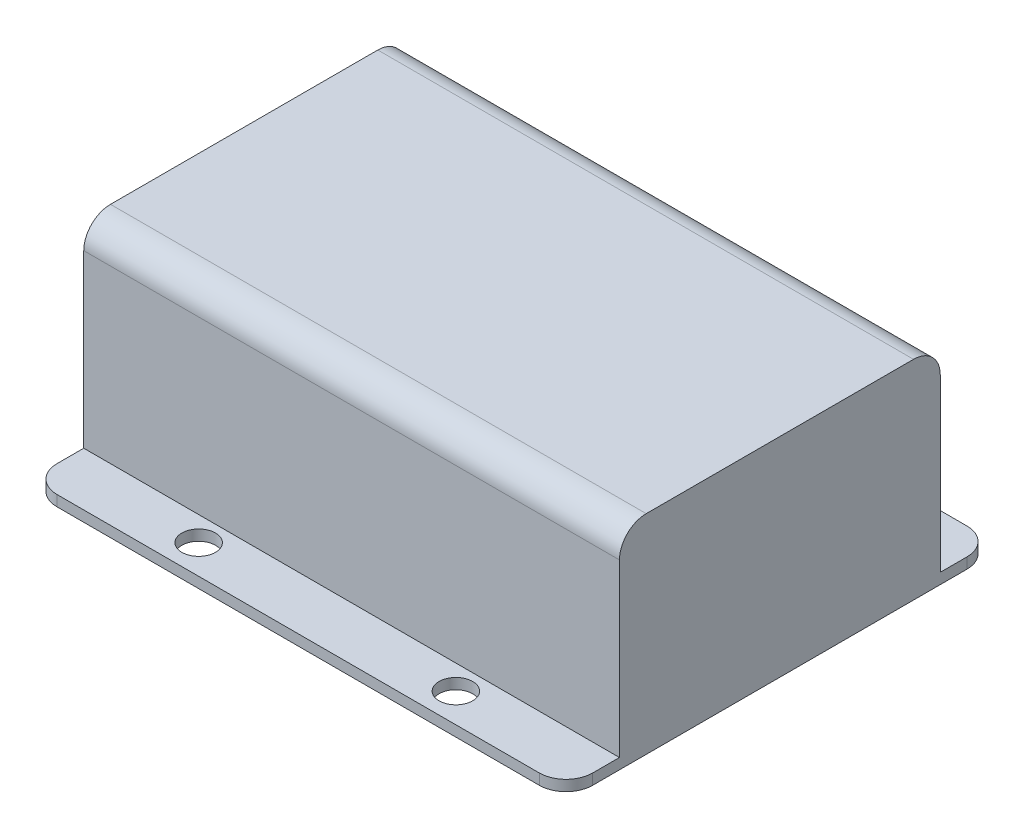
ISO-10303-21;
HEADER;
FILE_DESCRIPTION(('STEP AP214'),'2;1');
FILE_NAME('part.step','',(''),(''),'','','');
FILE_SCHEMA(('AUTOMOTIVE_DESIGN { 1 0 10303 214 1 1 1 1 }'));
ENDSEC;
DATA;
#1=APPLICATION_CONTEXT('core data for automotive mechanical design processes');
#2=APPLICATION_PROTOCOL_DEFINITION('international standard','automotive_design',2000,#1);
#3=PRODUCT_CONTEXT('',#1,'mechanical');
#4=PRODUCT('Part','Part','',(#3));
#5=PRODUCT_RELATED_PRODUCT_CATEGORY('part','',(#4));
#6=PRODUCT_DEFINITION_FORMATION('','',#4);
#7=PRODUCT_DEFINITION_CONTEXT('part definition',#1,'design');
#8=PRODUCT_DEFINITION('design','',#6,#7);
#9=PRODUCT_DEFINITION_SHAPE('','',#8);
#10=(LENGTH_UNIT() NAMED_UNIT(*) SI_UNIT(.MILLI.,.METRE.));
#11=(NAMED_UNIT(*) PLANE_ANGLE_UNIT() SI_UNIT($,.RADIAN.));
#12=(NAMED_UNIT(*) SI_UNIT($,.STERADIAN.) SOLID_ANGLE_UNIT());
#13=UNCERTAINTY_MEASURE_WITH_UNIT(LENGTH_MEASURE(1.E-05),#10,'distance_accuracy_value','');
#14=(GEOMETRIC_REPRESENTATION_CONTEXT(3) GLOBAL_UNCERTAINTY_ASSIGNED_CONTEXT((#13)) GLOBAL_UNIT_ASSIGNED_CONTEXT((#10,
#11,#12)) REPRESENTATION_CONTEXT('',''));
#15=CARTESIAN_POINT('',(0.,0.,0.));
#16=DIRECTION('',(0.,0.,1.));
#17=DIRECTION('',(1.,0.,0.));
#18=AXIS2_PLACEMENT_3D('',#15,#16,#17);
#19=CARTESIAN_POINT('',(0.,2.,0.));
#20=DIRECTION('',(0.,1.,0.));
#21=DIRECTION('',(0.,0.,1.));
#22=AXIS2_PLACEMENT_3D('',#19,#20,#21);
#23=PLANE('',#22);
#24=DIRECTION('',(-1.,0.,0.));
#25=VECTOR('',#24,1.);
#26=CARTESIAN_POINT('',(-50.01,2.,-40.));
#27=LINE('',#26,#25);
#28=CARTESIAN_POINT('',(45.19,2.,-40.));
#29=VERTEX_POINT('',#28);
#30=CARTESIAN_POINT('',(-45.01,2.,-40.));
#31=VERTEX_POINT('',#30);
#32=EDGE_CURVE('E164',#29,#31,#27,.T.);
#33=ORIENTED_EDGE('',*,*,#32,.T.);
#34=CARTESIAN_POINT('',(-45.01,2.,-35.));
#35=DIRECTION('',(0.,1.,0.));
#36=DIRECTION('',(0.,0.,1.));
#37=AXIS2_PLACEMENT_3D('',#34,#35,#36);
#38=CIRCLE('',#37,5.);
#39=CARTESIAN_POINT('',(-50.01,2.,-35.));
#40=VERTEX_POINT('',#39);
#41=EDGE_CURVE('E274',#31,#40,#38,.T.);
#42=ORIENTED_EDGE('',*,*,#41,.T.);
#43=DIRECTION('',(0.,0.,1.));
#44=VECTOR('',#43,1.);
#45=CARTESIAN_POINT('',(-50.01,2.,-40.));
#46=LINE('',#45,#44);
#47=CARTESIAN_POINT('',(-50.01,2.,-30.));
#48=VERTEX_POINT('',#47);
#49=EDGE_CURVE('E219',#40,#48,#46,.T.);
#50=ORIENTED_EDGE('',*,*,#49,.T.);
#51=DIRECTION('',(-1.,0.,0.));
#52=VECTOR('',#51,1.);
#53=CARTESIAN_POINT('',(-50.01,2.,-30.));
#54=LINE('',#53,#52);
#55=CARTESIAN_POINT('',(50.19,2.,-30.));
#56=VERTEX_POINT('',#55);
#57=EDGE_CURVE('E169',#56,#48,#54,.T.);
#58=ORIENTED_EDGE('',*,*,#57,.F.);
#59=DIRECTION('',(0.,0.,-1.));
#60=VECTOR('',#59,1.);
#61=CARTESIAN_POINT('',(50.19,2.,-40.));
#62=LINE('',#61,#60);
#63=CARTESIAN_POINT('',(50.19,2.,-35.));
#64=VERTEX_POINT('',#63);
#65=EDGE_CURVE('E165',#56,#64,#62,.T.);
#66=ORIENTED_EDGE('',*,*,#65,.T.);
#67=CARTESIAN_POINT('',(45.19,2.,-35.));
#68=DIRECTION('',(0.,1.,0.));
#69=DIRECTION('',(0.,0.,1.));
#70=AXIS2_PLACEMENT_3D('',#67,#68,#69);
#71=CIRCLE('',#70,5.);
#72=EDGE_CURVE('E271',#64,#29,#71,.T.);
#73=ORIENTED_EDGE('',*,*,#72,.T.);
#74=EDGE_LOOP('',(#33,#42,#50,#58,#66,#73));
#75=FACE_BOUND('',#74,.T.);
#76=CARTESIAN_POINT('',(24.14,2.,-34.55));
#77=DIRECTION('',(0.,1.,0.));
#78=DIRECTION('',(0.,0.,1.));
#79=AXIS2_PLACEMENT_3D('',#76,#77,#78);
#80=CIRCLE('',#79,3.13999999999999);
#81=CARTESIAN_POINT('',(24.14,2.,-31.41));
#82=VERTEX_POINT('',#81);
#83=EDGE_CURVE('E203',#82,#82,#80,.T.);
#84=ORIENTED_EDGE('',*,*,#83,.F.);
#85=EDGE_LOOP('',(#84));
#86=FACE_BOUND('',#85,.T.);
#87=CARTESIAN_POINT('',(-23.96,2.,-34.55));
#88=DIRECTION('',(0.,1.,0.));
#89=DIRECTION('',(0.,0.,1.));
#90=AXIS2_PLACEMENT_3D('',#87,#88,#89);
#91=CIRCLE('',#90,3.13999999999999);
#92=CARTESIAN_POINT('',(-23.96,2.,-31.41));
#93=VERTEX_POINT('',#92);
#94=EDGE_CURVE('E211',#93,#93,#91,.T.);
#95=ORIENTED_EDGE('',*,*,#94,.F.);
#96=EDGE_LOOP('',(#95));
#97=FACE_BOUND('',#96,.T.);
#98=ADVANCED_FACE('F39',(#75,#86,#97),#23,.T.);
#99=DIRECTION('',(1.,0.,0.));
#100=VECTOR('',#99,1.);
#101=CARTESIAN_POINT('',(-50.01,2.,40.));
#102=LINE('',#101,#100);
#103=CARTESIAN_POINT('',(-45.01,2.,40.));
#104=VERTEX_POINT('',#103);
#105=CARTESIAN_POINT('',(45.19,2.,40.));
#106=VERTEX_POINT('',#105);
#107=EDGE_CURVE('E223',#104,#106,#102,.T.);
#108=ORIENTED_EDGE('',*,*,#107,.T.);
#109=CARTESIAN_POINT('',(45.19,2.,35.));
#110=DIRECTION('',(0.,1.,0.));
#111=DIRECTION('',(0.,0.,1.));
#112=AXIS2_PLACEMENT_3D('',#109,#110,#111);
#113=CIRCLE('',#112,5.);
#114=CARTESIAN_POINT('',(50.19,2.,35.));
#115=VERTEX_POINT('',#114);
#116=EDGE_CURVE('E162',#106,#115,#113,.T.);
#117=ORIENTED_EDGE('',*,*,#116,.T.);
#118=CARTESIAN_POINT('',(50.19,2.,30.));
#119=VERTEX_POINT('',#118);
#120=EDGE_CURVE('E145',#115,#119,#62,.T.);
#121=ORIENTED_EDGE('',*,*,#120,.T.);
#122=DIRECTION('',(1.,0.,0.));
#123=VECTOR('',#122,1.);
#124=CARTESIAN_POINT('',(-50.01,2.,30.));
#125=LINE('',#124,#123);
#126=CARTESIAN_POINT('',(-50.01,2.,30.));
#127=VERTEX_POINT('',#126);
#128=EDGE_CURVE('E159',#127,#119,#125,.T.);
#129=ORIENTED_EDGE('',*,*,#128,.F.);
#130=CARTESIAN_POINT('',(-50.01,2.,35.));
#131=VERTEX_POINT('',#130);
#132=EDGE_CURVE('E224',#127,#131,#46,.T.);
#133=ORIENTED_EDGE('',*,*,#132,.T.);
#134=CARTESIAN_POINT('',(-45.01,2.,35.));
#135=DIRECTION('',(0.,1.,0.));
#136=DIRECTION('',(0.,0.,1.));
#137=AXIS2_PLACEMENT_3D('',#134,#135,#136);
#138=CIRCLE('',#137,5.);
#139=EDGE_CURVE('E290',#131,#104,#138,.T.);
#140=ORIENTED_EDGE('',*,*,#139,.T.);
#141=EDGE_LOOP('',(#108,#117,#121,#129,#133,#140));
#142=FACE_BOUND('',#141,.T.);
#143=CARTESIAN_POINT('',(24.1400000000007,2.,34.55));
#144=DIRECTION('',(0.,1.,0.));
#145=DIRECTION('',(0.,0.,1.));
#146=AXIS2_PLACEMENT_3D('',#143,#144,#145);
#147=CIRCLE('',#146,3.13999999999999);
#148=CARTESIAN_POINT('',(24.1400000000007,2.,37.69));
#149=VERTEX_POINT('',#148);
#150=EDGE_CURVE('E195',#149,#149,#147,.T.);
#151=ORIENTED_EDGE('',*,*,#150,.F.);
#152=EDGE_LOOP('',(#151));
#153=FACE_BOUND('',#152,.T.);
#154=CARTESIAN_POINT('',(-23.9599999999993,2.,34.55));
#155=DIRECTION('',(0.,1.,0.));
#156=DIRECTION('',(0.,0.,1.));
#157=AXIS2_PLACEMENT_3D('',#154,#155,#156);
#158=CIRCLE('',#157,3.13999999999999);
#159=CARTESIAN_POINT('',(-23.9599999999993,2.,37.69));
#160=VERTEX_POINT('',#159);
#161=EDGE_CURVE('E187',#160,#160,#158,.T.);
#162=ORIENTED_EDGE('',*,*,#161,.F.);
#163=EDGE_LOOP('',(#162));
#164=FACE_BOUND('',#163,.T.);
#165=ADVANCED_FACE('F156',(#142,#153,#164),#23,.T.);
#166=CARTESIAN_POINT('',(0.,0.,0.));
#167=DIRECTION('',(0.,1.,0.));
#168=DIRECTION('',(0.,0.,1.));
#169=AXIS2_PLACEMENT_3D('',#166,#167,#168);
#170=PLANE('',#169);
#171=DIRECTION('',(0.,0.,1.));
#172=VECTOR('',#171,1.);
#173=CARTESIAN_POINT('',(-50.01,0.,-40.));
#174=LINE('',#173,#172);
#175=CARTESIAN_POINT('',(-50.01,0.,-35.));
#176=VERTEX_POINT('',#175);
#177=CARTESIAN_POINT('',(-50.01,0.,35.));
#178=VERTEX_POINT('',#177);
#179=EDGE_CURVE('E215',#176,#178,#174,.T.);
#180=ORIENTED_EDGE('',*,*,#179,.F.);
#181=CARTESIAN_POINT('',(-45.01,0.,-35.));
#182=DIRECTION('',(0.,1.,0.));
#183=DIRECTION('',(0.,0.,1.));
#184=AXIS2_PLACEMENT_3D('',#181,#182,#183);
#185=CIRCLE('',#184,5.);
#186=CARTESIAN_POINT('',(-45.01,0.,-40.));
#187=VERTEX_POINT('',#186);
#188=EDGE_CURVE('E261',#176,#187,#185,.F.);
#189=ORIENTED_EDGE('',*,*,#188,.T.);
#190=DIRECTION('',(-1.,0.,0.));
#191=VECTOR('',#190,1.);
#192=CARTESIAN_POINT('',(-50.01,0.,-40.));
#193=LINE('',#192,#191);
#194=CARTESIAN_POINT('',(45.19,0.,-40.));
#195=VERTEX_POINT('',#194);
#196=EDGE_CURVE('E242',#195,#187,#193,.T.);
#197=ORIENTED_EDGE('',*,*,#196,.F.);
#198=CARTESIAN_POINT('',(45.19,0.,-35.));
#199=DIRECTION('',(0.,1.,0.));
#200=DIRECTION('',(0.,0.,1.));
#201=AXIS2_PLACEMENT_3D('',#198,#199,#200);
#202=CIRCLE('',#201,5.);
#203=CARTESIAN_POINT('',(50.19,0.,-35.));
#204=VERTEX_POINT('',#203);
#205=EDGE_CURVE('E258',#195,#204,#202,.F.);
#206=ORIENTED_EDGE('',*,*,#205,.T.);
#207=DIRECTION('',(0.,0.,-1.));
#208=VECTOR('',#207,1.);
#209=CARTESIAN_POINT('',(50.19,0.,-40.));
#210=LINE('',#209,#208);
#211=CARTESIAN_POINT('',(50.19,0.,35.));
#212=VERTEX_POINT('',#211);
#213=EDGE_CURVE('E238',#212,#204,#210,.T.);
#214=ORIENTED_EDGE('',*,*,#213,.F.);
#215=CARTESIAN_POINT('',(45.19,0.,35.));
#216=DIRECTION('',(0.,1.,0.));
#217=DIRECTION('',(0.,0.,1.));
#218=AXIS2_PLACEMENT_3D('',#215,#216,#217);
#219=CIRCLE('',#218,5.);
#220=CARTESIAN_POINT('',(45.19,0.,40.));
#221=VERTEX_POINT('',#220);
#222=EDGE_CURVE('E255',#212,#221,#219,.F.);
#223=ORIENTED_EDGE('',*,*,#222,.T.);
#224=DIRECTION('',(1.,0.,0.));
#225=VECTOR('',#224,1.);
#226=CARTESIAN_POINT('',(-50.01,0.,40.));
#227=LINE('',#226,#225);
#228=CARTESIAN_POINT('',(-45.01,0.,40.));
#229=VERTEX_POINT('',#228);
#230=EDGE_CURVE('E234',#229,#221,#227,.T.);
#231=ORIENTED_EDGE('',*,*,#230,.F.);
#232=CARTESIAN_POINT('',(-45.01,0.,35.));
#233=DIRECTION('',(0.,1.,0.));
#234=DIRECTION('',(0.,0.,1.));
#235=AXIS2_PLACEMENT_3D('',#232,#233,#234);
#236=CIRCLE('',#235,5.);
#237=EDGE_CURVE('E252',#229,#178,#236,.F.);
#238=ORIENTED_EDGE('',*,*,#237,.T.);
#239=EDGE_LOOP('',(#180,#189,#197,#206,#214,#223,#231,#238));
#240=FACE_BOUND('',#239,.T.);
#241=CARTESIAN_POINT('',(-23.96,0.,-34.55));
#242=DIRECTION('',(0.,1.,0.));
#243=DIRECTION('',(0.,0.,1.));
#244=AXIS2_PLACEMENT_3D('',#241,#242,#243);
#245=CIRCLE('',#244,3.13999999999999);
#246=CARTESIAN_POINT('',(-23.96,0.,-31.41));
#247=VERTEX_POINT('',#246);
#248=EDGE_CURVE('E207',#247,#247,#245,.T.);
#249=ORIENTED_EDGE('',*,*,#248,.T.);
#250=EDGE_LOOP('',(#249));
#251=FACE_BOUND('',#250,.T.);
#252=CARTESIAN_POINT('',(24.14,0.,-34.55));
#253=DIRECTION('',(0.,1.,0.));
#254=DIRECTION('',(0.,0.,1.));
#255=AXIS2_PLACEMENT_3D('',#252,#253,#254);
#256=CIRCLE('',#255,3.13999999999999);
#257=CARTESIAN_POINT('',(24.14,0.,-31.41));
#258=VERTEX_POINT('',#257);
#259=EDGE_CURVE('E199',#258,#258,#256,.T.);
#260=ORIENTED_EDGE('',*,*,#259,.T.);
#261=EDGE_LOOP('',(#260));
#262=FACE_BOUND('',#261,.T.);
#263=CARTESIAN_POINT('',(24.1400000000007,0.,34.55));
#264=DIRECTION('',(0.,1.,0.));
#265=DIRECTION('',(0.,0.,1.));
#266=AXIS2_PLACEMENT_3D('',#263,#264,#265);
#267=CIRCLE('',#266,3.13999999999999);
#268=CARTESIAN_POINT('',(24.1400000000007,0.,37.69));
#269=VERTEX_POINT('',#268);
#270=EDGE_CURVE('E191',#269,#269,#267,.T.);
#271=ORIENTED_EDGE('',*,*,#270,.T.);
#272=EDGE_LOOP('',(#271));
#273=FACE_BOUND('',#272,.T.);
#274=CARTESIAN_POINT('',(-23.9599999999993,0.,34.55));
#275=DIRECTION('',(0.,1.,0.));
#276=DIRECTION('',(0.,0.,1.));
#277=AXIS2_PLACEMENT_3D('',#274,#275,#276);
#278=CIRCLE('',#277,3.13999999999999);
#279=CARTESIAN_POINT('',(-23.9599999999993,0.,37.69));
#280=VERTEX_POINT('',#279);
#281=EDGE_CURVE('E186',#280,#280,#278,.T.);
#282=ORIENTED_EDGE('',*,*,#281,.T.);
#283=EDGE_LOOP('',(#282));
#284=FACE_BOUND('',#283,.T.);
#285=ADVANCED_FACE('F339',(#240,#251,#262,#273,#284),#170,.F.);
#286=CARTESIAN_POINT('',(-50.01,2.,-40.));
#287=DIRECTION('',(1.,0.,0.));
#288=DIRECTION('',(0.,0.,-1.));
#289=AXIS2_PLACEMENT_3D('',#286,#287,#288);
#290=PLANE('',#289);
#291=DIRECTION('',(0.,-1.,0.));
#292=VECTOR('',#291,1.);
#293=CARTESIAN_POINT('',(-50.01,39.,30.));
#294=LINE('',#293,#292);
#295=CARTESIAN_POINT('',(-50.01,34.,30.));
#296=VERTEX_POINT('',#295);
#297=EDGE_CURVE('E150',#296,#127,#294,.T.);
#298=ORIENTED_EDGE('',*,*,#297,.F.);
#299=CARTESIAN_POINT('',(-50.01,34.,25.));
#300=DIRECTION('',(1.,0.,0.));
#301=DIRECTION('',(0.,0.,-1.));
#302=AXIS2_PLACEMENT_3D('',#299,#300,#301);
#303=CIRCLE('',#302,5.);
#304=CARTESIAN_POINT('',(-50.01,39.,25.));
#305=VERTEX_POINT('',#304);
#306=EDGE_CURVE('E48',#296,#305,#303,.F.);
#307=ORIENTED_EDGE('',*,*,#306,.T.);
#308=DIRECTION('',(0.,0.,1.));
#309=VECTOR('',#308,1.);
#310=CARTESIAN_POINT('',(-50.01,39.,-30.));
#311=LINE('',#310,#309);
#312=CARTESIAN_POINT('',(-50.01,39.,-25.));
#313=VERTEX_POINT('',#312);
#314=EDGE_CURVE('E173',#313,#305,#311,.T.);
#315=ORIENTED_EDGE('',*,*,#314,.F.);
#316=CARTESIAN_POINT('',(-50.01,34.,-25.));
#317=DIRECTION('',(1.,0.,0.));
#318=DIRECTION('',(0.,0.,-1.));
#319=AXIS2_PLACEMENT_3D('',#316,#317,#318);
#320=CIRCLE('',#319,5.);
#321=CARTESIAN_POINT('',(-50.01,34.,-30.));
#322=VERTEX_POINT('',#321);
#323=EDGE_CURVE('E55',#313,#322,#320,.F.);
#324=ORIENTED_EDGE('',*,*,#323,.T.);
#325=DIRECTION('',(0.,-1.,0.));
#326=VECTOR('',#325,1.);
#327=CARTESIAN_POINT('',(-50.01,39.,-30.));
#328=LINE('',#327,#326);
#329=EDGE_CURVE('E179',#322,#48,#328,.T.);
#330=ORIENTED_EDGE('',*,*,#329,.T.);
#331=ORIENTED_EDGE('',*,*,#49,.F.);
#332=DIRECTION('',(0.,-1.,0.));
#333=VECTOR('',#332,1.);
#334=CARTESIAN_POINT('',(-50.01,2.,-35.));
#335=LINE('',#334,#333);
#336=EDGE_CURVE('E248',#40,#176,#335,.T.);
#337=ORIENTED_EDGE('',*,*,#336,.T.);
#338=ORIENTED_EDGE('',*,*,#179,.T.);
#339=DIRECTION('',(0.,-1.,0.));
#340=VECTOR('',#339,1.);
#341=CARTESIAN_POINT('',(-50.01,2.,35.));
#342=LINE('',#341,#340);
#343=EDGE_CURVE('E230',#178,#131,#342,.F.);
#344=ORIENTED_EDGE('',*,*,#343,.T.);
#345=ORIENTED_EDGE('',*,*,#132,.F.);
#346=EDGE_LOOP('',(#298,#307,#315,#324,#330,#331,#337,#338,#344,#345));
#347=FACE_BOUND('',#346,.T.);
#348=ADVANCED_FACE('F314',(#347),#290,.F.);
#349=CARTESIAN_POINT('',(-50.01,2.,40.));
#350=DIRECTION('',(0.,0.,-1.));
#351=DIRECTION('',(-1.,0.,0.));
#352=AXIS2_PLACEMENT_3D('',#349,#350,#351);
#353=PLANE('',#352);
#354=ORIENTED_EDGE('',*,*,#230,.T.);
#355=DIRECTION('',(0.,-1.,0.));
#356=VECTOR('',#355,1.);
#357=CARTESIAN_POINT('',(45.19,2.,40.));
#358=LINE('',#357,#356);
#359=EDGE_CURVE('E287',#221,#106,#358,.F.);
#360=ORIENTED_EDGE('',*,*,#359,.T.);
#361=ORIENTED_EDGE('',*,*,#107,.F.);
#362=DIRECTION('',(0.,-1.,0.));
#363=VECTOR('',#362,1.);
#364=CARTESIAN_POINT('',(-45.01,2.,40.));
#365=LINE('',#364,#363);
#366=EDGE_CURVE('E283',#104,#229,#365,.T.);
#367=ORIENTED_EDGE('',*,*,#366,.T.);
#368=EDGE_LOOP('',(#354,#360,#361,#367));
#369=FACE_BOUND('',#368,.T.);
#370=ADVANCED_FACE('F354',(#369),#353,.F.);
#371=CARTESIAN_POINT('',(50.19,2.,-40.));
#372=DIRECTION('',(-1.,0.,0.));
#373=DIRECTION('',(0.,0.,1.));
#374=AXIS2_PLACEMENT_3D('',#371,#372,#373);
#375=PLANE('',#374);
#376=DIRECTION('',(0.,0.,-1.));
#377=VECTOR('',#376,1.);
#378=CARTESIAN_POINT('',(50.19,39.,-30.));
#379=LINE('',#378,#377);
#380=CARTESIAN_POINT('',(50.19,39.,25.));
#381=VERTEX_POINT('',#380);
#382=CARTESIAN_POINT('',(50.19,39.,-25.));
#383=VERTEX_POINT('',#382);
#384=EDGE_CURVE('E176',#381,#383,#379,.T.);
#385=ORIENTED_EDGE('',*,*,#384,.F.);
#386=CARTESIAN_POINT('',(50.19,34.,25.));
#387=DIRECTION('',(-1.,0.,0.));
#388=DIRECTION('',(0.,0.,1.));
#389=AXIS2_PLACEMENT_3D('',#386,#387,#388);
#390=CIRCLE('',#389,5.);
#391=CARTESIAN_POINT('',(50.19,34.,30.));
#392=VERTEX_POINT('',#391);
#393=EDGE_CURVE('E147',#381,#392,#390,.F.);
#394=ORIENTED_EDGE('',*,*,#393,.T.);
#395=DIRECTION('',(0.,-1.,0.));
#396=VECTOR('',#395,1.);
#397=CARTESIAN_POINT('',(50.19,39.,30.));
#398=LINE('',#397,#396);
#399=EDGE_CURVE('E140',#392,#119,#398,.T.);
#400=ORIENTED_EDGE('',*,*,#399,.T.);
#401=ORIENTED_EDGE('',*,*,#120,.F.);
#402=DIRECTION('',(0.,-1.,0.));
#403=VECTOR('',#402,1.);
#404=CARTESIAN_POINT('',(50.19,2.,35.));
#405=LINE('',#404,#403);
#406=EDGE_CURVE('E277',#115,#212,#405,.T.);
#407=ORIENTED_EDGE('',*,*,#406,.T.);
#408=ORIENTED_EDGE('',*,*,#213,.T.);
#409=DIRECTION('',(0.,-1.,0.));
#410=VECTOR('',#409,1.);
#411=CARTESIAN_POINT('',(50.19,2.,-35.));
#412=LINE('',#411,#410);
#413=EDGE_CURVE('E280',#204,#64,#412,.F.);
#414=ORIENTED_EDGE('',*,*,#413,.T.);
#415=ORIENTED_EDGE('',*,*,#65,.F.);
#416=DIRECTION('',(0.,-1.,0.));
#417=VECTOR('',#416,1.);
#418=CARTESIAN_POINT('',(50.19,39.,-30.));
#419=LINE('',#418,#417);
#420=CARTESIAN_POINT('',(50.19,34.,-30.));
#421=VERTEX_POINT('',#420);
#422=EDGE_CURVE('E151',#421,#56,#419,.T.);
#423=ORIENTED_EDGE('',*,*,#422,.F.);
#424=CARTESIAN_POINT('',(50.19,34.,-25.));
#425=DIRECTION('',(-1.,0.,0.));
#426=DIRECTION('',(0.,0.,1.));
#427=AXIS2_PLACEMENT_3D('',#424,#425,#426);
#428=CIRCLE('',#427,5.);
#429=EDGE_CURVE('E303',#421,#383,#428,.F.);
#430=ORIENTED_EDGE('',*,*,#429,.T.);
#431=EDGE_LOOP('',(#385,#394,#400,#401,#407,#408,#414,#415,#423,#430));
#432=FACE_BOUND('',#431,.T.);
#433=ADVANCED_FACE('F143',(#432),#375,.F.);
#434=CARTESIAN_POINT('',(-50.01,2.,-40.));
#435=DIRECTION('',(0.,0.,1.));
#436=DIRECTION('',(1.,0.,0.));
#437=AXIS2_PLACEMENT_3D('',#434,#435,#436);
#438=PLANE('',#437);
#439=ORIENTED_EDGE('',*,*,#196,.T.);
#440=DIRECTION('',(0.,-1.,0.));
#441=VECTOR('',#440,1.);
#442=CARTESIAN_POINT('',(-45.01,2.,-40.));
#443=LINE('',#442,#441);
#444=EDGE_CURVE('E268',#187,#31,#443,.F.);
#445=ORIENTED_EDGE('',*,*,#444,.T.);
#446=ORIENTED_EDGE('',*,*,#32,.F.);
#447=DIRECTION('',(0.,-1.,0.));
#448=VECTOR('',#447,1.);
#449=CARTESIAN_POINT('',(45.19,2.,-40.));
#450=LINE('',#449,#448);
#451=EDGE_CURVE('E264',#29,#195,#450,.T.);
#452=ORIENTED_EDGE('',*,*,#451,.T.);
#453=EDGE_LOOP('',(#439,#445,#446,#452));
#454=FACE_BOUND('',#453,.T.);
#455=ADVANCED_FACE('F348',(#454),#438,.F.);
#456=CARTESIAN_POINT('',(-23.96,2.,-34.55));
#457=DIRECTION('',(0.,-1.,0.));
#458=DIRECTION('',(0.,0.,-1.));
#459=AXIS2_PLACEMENT_3D('',#456,#457,#458);
#460=CYLINDRICAL_SURFACE('',#459,3.13999999999999);
#461=ORIENTED_EDGE('',*,*,#94,.T.);
#462=EDGE_LOOP('',(#461));
#463=FACE_BOUND('',#462,.T.);
#464=ORIENTED_EDGE('',*,*,#248,.F.);
#465=EDGE_LOOP('',(#464));
#466=FACE_BOUND('',#465,.T.);
#467=ADVANCED_FACE('F343',(#463,#466),#460,.F.);
#468=CARTESIAN_POINT('',(24.14,2.,-34.55));
#469=DIRECTION('',(0.,-1.,0.));
#470=DIRECTION('',(0.,0.,-1.));
#471=AXIS2_PLACEMENT_3D('',#468,#469,#470);
#472=CYLINDRICAL_SURFACE('',#471,3.13999999999999);
#473=ORIENTED_EDGE('',*,*,#83,.T.);
#474=EDGE_LOOP('',(#473));
#475=FACE_BOUND('',#474,.T.);
#476=ORIENTED_EDGE('',*,*,#259,.F.);
#477=EDGE_LOOP('',(#476));
#478=FACE_BOUND('',#477,.T.);
#479=ADVANCED_FACE('F416',(#475,#478),#472,.F.);
#480=CARTESIAN_POINT('',(24.1400000000007,2.,34.55));
#481=DIRECTION('',(0.,-1.,0.));
#482=DIRECTION('',(0.,0.,-1.));
#483=AXIS2_PLACEMENT_3D('',#480,#481,#482);
#484=CYLINDRICAL_SURFACE('',#483,3.13999999999999);
#485=ORIENTED_EDGE('',*,*,#150,.T.);
#486=EDGE_LOOP('',(#485));
#487=FACE_BOUND('',#486,.T.);
#488=ORIENTED_EDGE('',*,*,#270,.F.);
#489=EDGE_LOOP('',(#488));
#490=FACE_BOUND('',#489,.T.);
#491=ADVANCED_FACE('F413',(#487,#490),#484,.F.);
#492=CARTESIAN_POINT('',(-23.9599999999993,2.,34.55));
#493=DIRECTION('',(0.,-1.,0.));
#494=DIRECTION('',(0.,0.,-1.));
#495=AXIS2_PLACEMENT_3D('',#492,#493,#494);
#496=CYLINDRICAL_SURFACE('',#495,3.13999999999999);
#497=ORIENTED_EDGE('',*,*,#161,.T.);
#498=EDGE_LOOP('',(#497));
#499=FACE_BOUND('',#498,.T.);
#500=ORIENTED_EDGE('',*,*,#281,.F.);
#501=EDGE_LOOP('',(#500));
#502=FACE_BOUND('',#501,.T.);
#503=ADVANCED_FACE('F408',(#499,#502),#496,.F.);
#504=CARTESIAN_POINT('',(-50.01,39.,30.));
#505=DIRECTION('',(0.,0.,-1.));
#506=DIRECTION('',(-1.,0.,0.));
#507=AXIS2_PLACEMENT_3D('',#504,#505,#506);
#508=PLANE('',#507);
#509=ORIENTED_EDGE('',*,*,#399,.F.);
#510=DIRECTION('',(1.,0.,0.));
#511=VECTOR('',#510,1.);
#512=CARTESIAN_POINT('',(-50.01,34.,30.));
#513=LINE('',#512,#511);
#514=EDGE_CURVE('E63',#392,#296,#513,.F.);
#515=ORIENTED_EDGE('',*,*,#514,.T.);
#516=ORIENTED_EDGE('',*,*,#297,.T.);
#517=ORIENTED_EDGE('',*,*,#128,.T.);
#518=EDGE_LOOP('',(#509,#515,#516,#517));
#519=FACE_BOUND('',#518,.T.);
#520=ADVANCED_FACE('F167',(#519),#508,.F.);
#521=CARTESIAN_POINT('',(-50.01,39.,-30.));
#522=DIRECTION('',(0.,0.,1.));
#523=DIRECTION('',(1.,0.,0.));
#524=AXIS2_PLACEMENT_3D('',#521,#522,#523);
#525=PLANE('',#524);
#526=ORIENTED_EDGE('',*,*,#329,.F.);
#527=DIRECTION('',(-1.,0.,0.));
#528=VECTOR('',#527,1.);
#529=CARTESIAN_POINT('',(50.19,34.,-30.));
#530=LINE('',#529,#528);
#531=EDGE_CURVE('E11',#322,#421,#530,.F.);
#532=ORIENTED_EDGE('',*,*,#531,.T.);
#533=ORIENTED_EDGE('',*,*,#422,.T.);
#534=ORIENTED_EDGE('',*,*,#57,.T.);
#535=EDGE_LOOP('',(#526,#532,#533,#534));
#536=FACE_BOUND('',#535,.T.);
#537=ADVANCED_FACE('F397',(#536),#525,.F.);
#538=CARTESIAN_POINT('',(0.,39.,0.));
#539=DIRECTION('',(0.,1.,0.));
#540=DIRECTION('',(0.,0.,1.));
#541=AXIS2_PLACEMENT_3D('',#538,#539,#540);
#542=PLANE('',#541);
#543=ORIENTED_EDGE('',*,*,#314,.T.);
#544=DIRECTION('',(1.,0.,0.));
#545=VECTOR('',#544,1.);
#546=CARTESIAN_POINT('',(50.19,39.,25.));
#547=LINE('',#546,#545);
#548=EDGE_CURVE('E299',#305,#381,#547,.T.);
#549=ORIENTED_EDGE('',*,*,#548,.T.);
#550=ORIENTED_EDGE('',*,*,#384,.T.);
#551=DIRECTION('',(-1.,0.,0.));
#552=VECTOR('',#551,1.);
#553=CARTESIAN_POINT('',(-50.01,39.,-25.));
#554=LINE('',#553,#552);
#555=EDGE_CURVE('E295',#383,#313,#554,.T.);
#556=ORIENTED_EDGE('',*,*,#555,.T.);
#557=EDGE_LOOP('',(#543,#549,#550,#556));
#558=FACE_BOUND('',#557,.T.);
#559=ADVANCED_FACE('F318',(#558),#542,.T.);
#560=CARTESIAN_POINT('',(-45.01,2.,-35.));
#561=DIRECTION('',(0.,-1.,0.));
#562=DIRECTION('',(0.,0.,-1.));
#563=AXIS2_PLACEMENT_3D('',#560,#561,#562);
#564=CYLINDRICAL_SURFACE('',#563,5.);
#565=ORIENTED_EDGE('',*,*,#41,.F.);
#566=ORIENTED_EDGE('',*,*,#444,.F.);
#567=ORIENTED_EDGE('',*,*,#188,.F.);
#568=ORIENTED_EDGE('',*,*,#336,.F.);
#569=EDGE_LOOP('',(#565,#566,#567,#568));
#570=FACE_BOUND('',#569,.T.);
#571=ADVANCED_FACE('F360',(#570),#564,.T.);
#572=CARTESIAN_POINT('',(45.19,2.,-35.));
#573=DIRECTION('',(0.,-1.,0.));
#574=DIRECTION('',(0.,0.,-1.));
#575=AXIS2_PLACEMENT_3D('',#572,#573,#574);
#576=CYLINDRICAL_SURFACE('',#575,5.);
#577=ORIENTED_EDGE('',*,*,#72,.F.);
#578=ORIENTED_EDGE('',*,*,#413,.F.);
#579=ORIENTED_EDGE('',*,*,#205,.F.);
#580=ORIENTED_EDGE('',*,*,#451,.F.);
#581=EDGE_LOOP('',(#577,#578,#579,#580));
#582=FACE_BOUND('',#581,.T.);
#583=ADVANCED_FACE('F363',(#582),#576,.T.);
#584=CARTESIAN_POINT('',(45.19,2.,35.));
#585=DIRECTION('',(0.,-1.,0.));
#586=DIRECTION('',(0.,0.,-1.));
#587=AXIS2_PLACEMENT_3D('',#584,#585,#586);
#588=CYLINDRICAL_SURFACE('',#587,5.);
#589=ORIENTED_EDGE('',*,*,#116,.F.);
#590=ORIENTED_EDGE('',*,*,#359,.F.);
#591=ORIENTED_EDGE('',*,*,#222,.F.);
#592=ORIENTED_EDGE('',*,*,#406,.F.);
#593=EDGE_LOOP('',(#589,#590,#591,#592));
#594=FACE_BOUND('',#593,.T.);
#595=ADVANCED_FACE('F330',(#594),#588,.T.);
#596=CARTESIAN_POINT('',(-45.01,2.,35.));
#597=DIRECTION('',(0.,-1.,0.));
#598=DIRECTION('',(0.,0.,-1.));
#599=AXIS2_PLACEMENT_3D('',#596,#597,#598);
#600=CYLINDRICAL_SURFACE('',#599,5.);
#601=ORIENTED_EDGE('',*,*,#139,.F.);
#602=ORIENTED_EDGE('',*,*,#343,.F.);
#603=ORIENTED_EDGE('',*,*,#237,.F.);
#604=ORIENTED_EDGE('',*,*,#366,.F.);
#605=EDGE_LOOP('',(#601,#602,#603,#604));
#606=FACE_BOUND('',#605,.T.);
#607=ADVANCED_FACE('F324',(#606),#600,.T.);
#608=CARTESIAN_POINT('',(0.,34.,25.));
#609=DIRECTION('',(-1.,0.,0.));
#610=DIRECTION('',(0.,0.,1.));
#611=AXIS2_PLACEMENT_3D('',#608,#609,#610);
#612=CYLINDRICAL_SURFACE('',#611,5.);
#613=ORIENTED_EDGE('',*,*,#306,.F.);
#614=ORIENTED_EDGE('',*,*,#514,.F.);
#615=ORIENTED_EDGE('',*,*,#393,.F.);
#616=ORIENTED_EDGE('',*,*,#548,.F.);
#617=EDGE_LOOP('',(#613,#614,#615,#616));
#618=FACE_BOUND('',#617,.T.);
#619=ADVANCED_FACE('F322',(#618),#612,.T.);
#620=CARTESIAN_POINT('',(0.,34.,-25.));
#621=DIRECTION('',(1.,0.,0.));
#622=DIRECTION('',(0.,0.,-1.));
#623=AXIS2_PLACEMENT_3D('',#620,#621,#622);
#624=CYLINDRICAL_SURFACE('',#623,5.);
#625=ORIENTED_EDGE('',*,*,#429,.F.);
#626=ORIENTED_EDGE('',*,*,#531,.F.);
#627=ORIENTED_EDGE('',*,*,#323,.F.);
#628=ORIENTED_EDGE('',*,*,#555,.F.);
#629=EDGE_LOOP('',(#625,#626,#627,#628));
#630=FACE_BOUND('',#629,.T.);
#631=ADVANCED_FACE('F41',(#630),#624,.T.);
#632=CLOSED_SHELL('',(#98,#165,#285,#348,#370,#433,#455,#467,#479,#491,#503,#520,#537,#559,#571,
#583,#595,#607,#619,#631));
#633=MANIFOLD_SOLID_BREP('B2',#632);
#634=ADVANCED_BREP_SHAPE_REPRESENTATION('',(#18,#633),#14);
#635=SHAPE_DEFINITION_REPRESENTATION(#9,#634);
ENDSEC;
END-ISO-10303-21;
